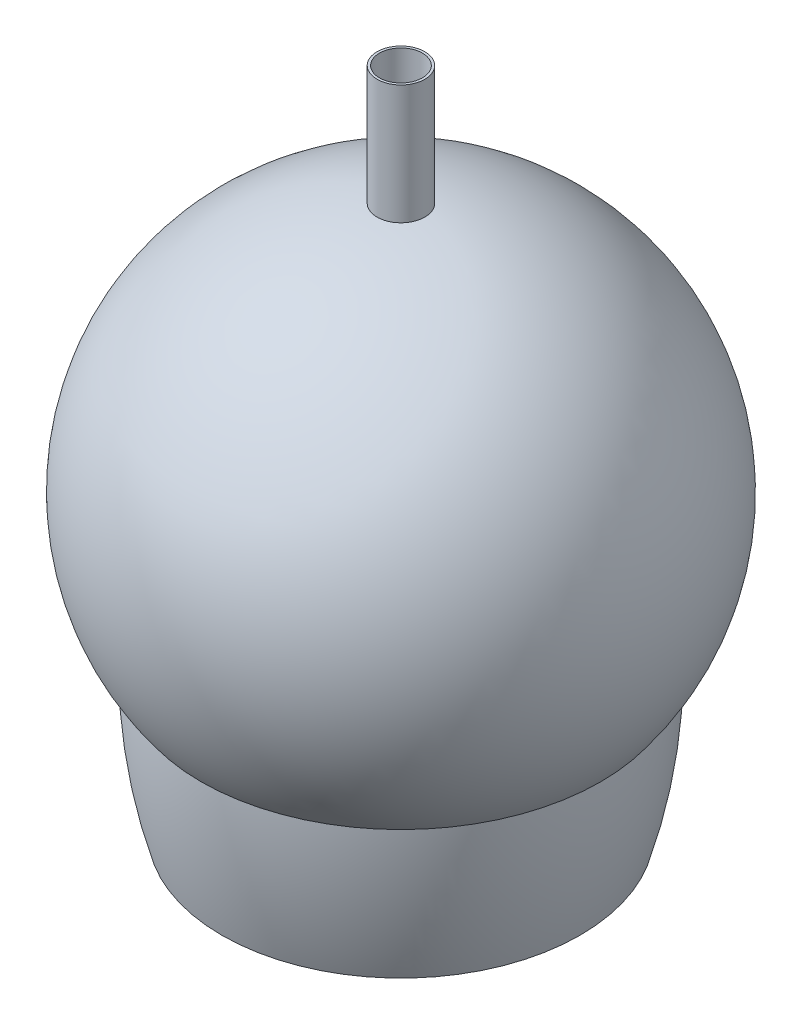
ISO-10303-21;
HEADER;
FILE_DESCRIPTION(('STEP AP214'),'2;1');
FILE_NAME('part.step','',(''),(''),'','','');
FILE_SCHEMA(('AUTOMOTIVE_DESIGN { 1 0 10303 214 1 1 1 1 }'));
ENDSEC;
DATA;
#1=APPLICATION_CONTEXT('core data for automotive mechanical design processes');
#2=APPLICATION_PROTOCOL_DEFINITION('international standard','automotive_design',2000,#1);
#3=PRODUCT_CONTEXT('',#1,'mechanical');
#4=PRODUCT('Part','Part','',(#3));
#5=PRODUCT_RELATED_PRODUCT_CATEGORY('part','',(#4));
#6=PRODUCT_DEFINITION_FORMATION('','',#4);
#7=PRODUCT_DEFINITION_CONTEXT('part definition',#1,'design');
#8=PRODUCT_DEFINITION('design','',#6,#7);
#9=PRODUCT_DEFINITION_SHAPE('','',#8);
#10=(LENGTH_UNIT() NAMED_UNIT(*) SI_UNIT(.MILLI.,.METRE.));
#11=(NAMED_UNIT(*) PLANE_ANGLE_UNIT() SI_UNIT($,.RADIAN.));
#12=(NAMED_UNIT(*) SI_UNIT($,.STERADIAN.) SOLID_ANGLE_UNIT());
#13=UNCERTAINTY_MEASURE_WITH_UNIT(LENGTH_MEASURE(1.E-05),#10,'distance_accuracy_value','');
#14=(GEOMETRIC_REPRESENTATION_CONTEXT(3) GLOBAL_UNCERTAINTY_ASSIGNED_CONTEXT((#13)) GLOBAL_UNIT_ASSIGNED_CONTEXT((#10,
#11,#12)) REPRESENTATION_CONTEXT('',''));
#15=CARTESIAN_POINT('',(0.,0.,0.));
#16=DIRECTION('',(0.,0.,1.));
#17=DIRECTION('',(1.,0.,0.));
#18=AXIS2_PLACEMENT_3D('',#15,#16,#17);
#19=CARTESIAN_POINT('',(0.,0.,0.));
#20=DIRECTION('',(0.,-1.,0.));
#21=DIRECTION('',(0.,0.,-1.));
#22=AXIS2_PLACEMENT_3D('',#19,#20,#21);
#23=CYLINDRICAL_SURFACE('',#22,9.);
#24=CARTESIAN_POINT('',(0.,277.966543330308,0.));
#25=DIRECTION('',(0.,-1.,0.));
#26=DIRECTION('',(0.,0.,-1.));
#27=AXIS2_PLACEMENT_3D('',#24,#25,#26);
#28=CIRCLE('',#27,9.);
#29=CARTESIAN_POINT('',(0.,277.966543330308,-9.));
#30=VERTEX_POINT('',#29);
#31=EDGE_CURVE('E76',#30,#30,#28,.T.);
#32=ORIENTED_EDGE('',*,*,#31,.F.);
#33=EDGE_LOOP('',(#32));
#34=FACE_BOUND('',#33,.T.);
#35=CARTESIAN_POINT('',(0.,227.053663620531,0.));
#36=DIRECTION('',(0.,-1.,0.));
#37=DIRECTION('',(0.,0.,-1.));
#38=AXIS2_PLACEMENT_3D('',#35,#36,#37);
#39=CIRCLE('',#38,9.);
#40=CARTESIAN_POINT('',(-8.99999999999953,227.053663620531,0.));
#41=VERTEX_POINT('',#40);
#42=EDGE_CURVE('E10',#41,#41,#39,.T.);
#43=ORIENTED_EDGE('',*,*,#42,.T.);
#44=EDGE_LOOP('',(#43));
#45=FACE_BOUND('',#44,.T.);
#46=ADVANCED_FACE('F41',(#34,#45),#23,.F.);
#47=CARTESIAN_POINT('',(0.,123.443818528474,0.));
#48=DIRECTION('',(0.,-1.,0.));
#49=DIRECTION('',(-1.,0.,0.));
#50=AXIS2_PLACEMENT_3D('',#47,#48,#49);
#51=SPHERICAL_SURFACE('',#50,104.);
#52=CARTESIAN_POINT('',(0.,60.3383292849695,0.));
#53=DIRECTION('',(0.,-1.,0.));
#54=DIRECTION('',(0.,0.,-1.));
#55=AXIS2_PLACEMENT_3D('',#52,#53,#54);
#56=CIRCLE('',#55,82.6661794649901);
#57=CARTESIAN_POINT('',(-82.6661794649901,60.3383292849695,0.));
#58=VERTEX_POINT('',#57);
#59=EDGE_CURVE('E48',#58,#58,#56,.T.);
#60=CARTESIAN_POINT('',(-8.99999999999953,227.053663620531,0.));
#61=CARTESIAN_POINT('',(-10.1527453132222,226.953538919084,0.));
#62=CARTESIAN_POINT('',(-11.3038177871058,226.834161308276,0.));
#63=CARTESIAN_POINT('',(-13.6013388798546,226.557066931475,0.));
#64=CARTESIAN_POINT('',(-14.7477874987198,226.399350165481,0.));
#65=CARTESIAN_POINT('',(-17.0347827050919,226.045744141842,0.));
#66=CARTESIAN_POINT('',(-18.1753292925988,225.849854884197,0.));
#67=CARTESIAN_POINT('',(-20.4492502146285,225.420124506647,0.));
#68=CARTESIAN_POINT('',(-21.5826245491513,225.186283386741,0.));
#69=CARTESIAN_POINT('',(-23.8409383633198,224.680909124289,0.));
#70=CARTESIAN_POINT('',(-24.9658778429656,224.409375981744,0.));
#71=CARTESIAN_POINT('',(-27.2060688405937,223.828920322319,0.));
#72=CARTESIAN_POINT('',(-28.3213203585762,223.519997805441,0.));
#73=CARTESIAN_POINT('',(-30.5408930914573,222.865107475449,0.));
#74=CARTESIAN_POINT('',(-31.645214306356,222.519139662335,0.));
#75=CARTESIAN_POINT('',(-33.8416962745883,221.790544143611,0.));
#76=CARTESIAN_POINT('',(-34.9338570279219,221.407916438001,0.));
#77=CARTESIAN_POINT('',(-37.1048014587974,220.606427359551,0.));
#78=CARTESIAN_POINT('',(-38.1835851363394,220.187565986712,0.));
#79=CARTESIAN_POINT('',(-40.3265737033262,219.314076165843,0.));
#80=CARTESIAN_POINT('',(-41.3907785927711,218.859447717814,0.));
#81=CARTESIAN_POINT('',(-43.5034241111803,217.914930180248,0.));
#82=CARTESIAN_POINT('',(-44.5518647401446,217.425041090712,0.));
#83=CARTESIAN_POINT('',(-46.6318138258636,216.410547982755,0.));
#84=CARTESIAN_POINT('',(-47.6633222826183,215.885943964335,0.));
#85=CARTESIAN_POINT('',(-49.7082579737931,214.802605381887,0.));
#86=CARTESIAN_POINT('',(-50.7216852082132,214.24387081786,0.));
#87=CARTESIAN_POINT('',(-52.7293295461968,213.092893547265,0.));
#88=CARTESIAN_POINT('',(-53.7235466497603,212.500650840697,0.));
#89=CARTESIAN_POINT('',(-55.6916632166566,211.283317014513,0.));
#90=CARTESIAN_POINT('',(-56.6655626799896,210.658225894898,0.));
#91=CARTESIAN_POINT('',(-58.5919590899117,209.375891563648,0.));
#92=CARTESIAN_POINT('',(-59.544456036501,208.718648352013,0.));
#93=CARTESIAN_POINT('',(-61.4269863777827,207.372741973613,0.));
#94=CARTESIAN_POINT('',(-62.3570197724751,206.684078806848,0.));
#95=CARTESIAN_POINT('',(-64.1935869981114,205.276099655375,0.));
#96=CARTESIAN_POINT('',(-65.1001208290553,204.556783670668,0.));
#97=CARTESIAN_POINT('',(-66.888679092711,203.088300166241,0.));
#98=CARTESIAN_POINT('',(-67.7707035254228,202.339132646523,0.));
#99=CARTESIAN_POINT('',(-69.5092604604052,200.811780608161,0.));
#100=CARTESIAN_POINT('',(-70.3657929626759,200.033596089518,0.));
#101=CARTESIAN_POINT('',(-72.0524119013345,198.449076912915,0.));
#102=CARTESIAN_POINT('',(-72.8824983377224,197.642742254955,0.));
#103=CARTESIAN_POINT('',(-74.5153004688018,196.002821017211,0.));
#104=CARTESIAN_POINT('',(-75.3180161634932,195.169234437426,0.));
#105=CARTESIAN_POINT('',(-76.8951826250375,193.475737930832,0.));
#106=CARTESIAN_POINT('',(-77.6696333918904,192.615828004025,0.));
#107=CARTESIAN_POINT('',(-79.1894072973668,190.870642701114,0.));
#108=CARTESIAN_POINT('',(-79.9347304359904,189.985367325011,0.));
#109=CARTESIAN_POINT('',(-81.3954188313749,188.190437277111,0.));
#110=CARTESIAN_POINT('',(-82.1107840881359,187.280782605315,0.));
#111=CARTESIAN_POINT('',(-83.5107598377816,185.438107276976,0.));
#112=CARTESIAN_POINT('',(-84.1953703306664,184.505086620434,0.));
#113=CARTESIAN_POINT('',(-85.5330739298535,182.616718662121,0.));
#114=CARTESIAN_POINT('',(-86.1861670361558,181.661371360349,0.));
#115=CARTESIAN_POINT('',(-87.4601083483033,179.729414321886,0.));
#116=CARTESIAN_POINT('',(-88.0809565541486,178.752804585194,0.));
#117=CARTESIAN_POINT('',(-89.2897164707544,176.779410572517,0.));
#118=CARTESIAN_POINT('',(-89.8776281815149,175.782626296531,0.));
#119=CARTESIAN_POINT('',(-91.019860202973,173.769993574344,0.));
#120=CARTESIAN_POINT('',(-91.5741805136706,172.754145128143,0.));
#121=CARTESIAN_POINT('',(-92.6486122492063,170.704515671158,0.));
#122=CARTESIAN_POINT('',(-93.1687236740444,169.670734660376,0.));
#123=CARTESIAN_POINT('',(-94.1741582590953,167.586391655866,0.));
#124=CARTESIAN_POINT('',(-94.6594814193081,166.53582966214,0.));
#125=CARTESIAN_POINT('',(-95.5947988487732,164.419094966576,0.));
#126=CARTESIAN_POINT('',(-96.0447931180255,163.352922264739,0.));
#127=CARTESIAN_POINT('',(-96.908951493896,161.206153817357,0.));
#128=CARTESIAN_POINT('',(-97.3231156005142,160.125558071812,0.));
#129=CARTESIAN_POINT('',(-98.1151522924972,157.951147267981,0.));
#130=CARTESIAN_POINT('',(-98.4930248778619,156.857332209696,0.));
#131=CARTESIAN_POINT('',(-99.2120575957036,154.657701237024,0.));
#132=CARTESIAN_POINT('',(-99.5532177281805,153.551885322637,0.));
#133=CARTESIAN_POINT('',(-100.198445504494,151.329484462771,0.));
#134=CARTESIAN_POINT('',(-100.502513148331,150.21289951729,0.));
#135=CARTESIAN_POINT('',(-101.073217230837,147.970204416419,0.));
#136=CARTESIAN_POINT('',(-101.339853669506,146.844094261027,0.));
#137=CARTESIAN_POINT('',(-101.835398321684,144.583603172135,0.));
#138=CARTESIAN_POINT('',(-102.064306535193,143.449222238634,0.));
#139=CARTESIAN_POINT('',(-102.484139744464,141.173453238569,0.));
#140=CARTESIAN_POINT('',(-102.675064740226,140.032065172005,0.));
#141=CARTESIAN_POINT('',(-103.018718832868,137.743553356463,0.));
#142=CARTESIAN_POINT('',(-103.171447929747,136.596429607486,0.));
#143=CARTESIAN_POINT('',(-103.438540091857,134.297724267038,0.));
#144=CARTESIAN_POINT('',(-103.552903157087,133.146142675568,0.));
#145=CARTESIAN_POINT('',(-103.74313586102,130.839804455874,0.));
#146=CARTESIAN_POINT('',(-103.819005499722,129.685047827651,0.));
#147=CARTESIAN_POINT('',(-103.932166835522,127.373645877029,0.));
#148=CARTESIAN_POINT('',(-103.96945853262,126.217000554629,0.));
#149=CARTESIAN_POINT('',(-104.005422444077,123.903109662141,0.));
#150=CARTESIAN_POINT('',(-104.004094658436,122.745864092054,0.));
#151=CARTESIAN_POINT('',(-103.962821083507,120.432061819327,0.));
#152=CARTESIAN_POINT('',(-103.922875294217,119.275505116688,0.));
#153=CARTESIAN_POINT('',(-103.804410209651,116.964368926628,0.));
#154=CARTESIAN_POINT('',(-103.725890914374,115.809789439208,0.));
#155=CARTESIAN_POINT('',(-103.530366284498,113.503893824837,0.));
#156=CARTESIAN_POINT('',(-103.4133609499,112.352577697886,0.));
#157=CARTESIAN_POINT('',(-103.140994579618,110.054491314479,0.));
#158=CARTESIAN_POINT('',(-102.985633543936,108.907721058022,0.));
#159=CARTESIAN_POINT('',(-102.636728836105,106.62000386175,0.));
#160=CARTESIAN_POINT('',(-102.443185163956,105.479056921935,0.));
#161=CARTESIAN_POINT('',(-102.018130781406,103.204257318204,0.));
#162=CARTESIAN_POINT('',(-101.786620071004,102.070404654287,0.));
#163=CARTESIAN_POINT('',(-101.285889503592,99.8110566589302,0.));
#164=CARTESIAN_POINT('',(-101.016669646581,98.68556132749,0.));
#165=CARTESIAN_POINT('',(-100.440820683739,96.4441817440072,0.));
#166=CARTESIAN_POINT('',(-100.134191577908,95.3282974919645,0.));
#167=CARTESIAN_POINT('',(-99.4838656873118,93.107383107911,0.));
#168=CARTESIAN_POINT('',(-99.140168902547,92.0023529759001,0.));
#169=CARTESIAN_POINT('',(-98.4160905154897,89.8043777816316,0.));
#170=CARTESIAN_POINT('',(-98.0357089131973,88.711432719374,0.));
#171=CARTESIAN_POINT('',(-97.2386846178386,86.5388451519775,0.));
#172=CARTESIAN_POINT('',(-96.8220419247723,85.4592026468386,0.));
#173=CARTESIAN_POINT('',(-95.9529595667753,83.314422863308,0.));
#174=CARTESIAN_POINT('',(-95.5005199018447,82.2492855849162,0.));
#175=CARTESIAN_POINT('',(-94.5603475985849,80.1347027639188,0.));
#176=CARTESIAN_POINT('',(-94.0726149602557,79.0852572213132,0.));
#177=CARTESIAN_POINT('',(-93.0624000103462,77.0032269103316,0.));
#178=CARTESIAN_POINT('',(-92.5399176987658,75.9706421419555,0.));
#179=CARTESIAN_POINT('',(-91.4607854603477,73.9234836013392,0.));
#180=CARTESIAN_POINT('',(-90.90413553351,72.9089098290989,0.));
#181=CARTESIAN_POINT('',(-89.7572880029782,70.8989035678833,0.));
#182=CARTESIAN_POINT('',(-89.1670903992842,69.9034710789079,0.));
#183=CARTESIAN_POINT('',(-87.9538054981122,67.9328558689742,0.));
#184=CARTESIAN_POINT('',(-87.3307182006342,66.9576731480158,0.));
#185=CARTESIAN_POINT('',(-86.0523460163521,65.0286451927034,0.));
#186=CARTESIAN_POINT('',(-85.3970611295481,64.0747999583495,0.));
#187=CARTESIAN_POINT('',(-84.0550311279388,62.1895042414761,0.));
#188=CARTESIAN_POINT('',(-83.3682860131335,61.2580537589567,0.));
#189=CARTESIAN_POINT('',(-82.6661794649901,60.3383292849696,0.));
#190=B_SPLINE_CURVE_WITH_KNOTS('',3,(#60,#61,#62,#63,#64,#65,#66,#67,#68,#69,#70,#71,#72,#73,
#74,#75,#76,#77,#78,#79,#80,#81,#82,#83,#84,#85,#86,#87,#88,#89,#90,#91,#92,#93,#94,#95,#96,#97,
#98,#99,#100,#101,#102,#103,#104,#105,#106,#107,#108,#109,#110,#111,#112,#113,#114,#115,#116,
#117,#118,#119,#120,#121,#122,#123,#124,#125,#126,#127,#128,#129,#130,#131,#132,#133,#134,#135,
#136,#137,#138,#139,#140,#141,#142,#143,#144,#145,#146,#147,#148,#149,#150,#151,#152,#153,#154,
#155,#156,#157,#158,#159,#160,#161,#162,#163,#164,#165,#166,#167,#168,#169,#170,#171,#172,#173,
#174,#175,#176,#177,#178,#179,#180,#181,#182,#183,#184,#185,#186,#187,#188,#189),.UNSPECIFIED.,
.F.,.F.,(4,2,2,2,2,2,2,2,2,2,2,2,2,2,2,2,2,2,2,2,2,2,2,2,2,2,2,2,2,2,2,2,2,2,2,2,2,2,2,2,2,2,2,
2,2,2,2,2,2,2,2,2,2,2,2,2,2,2,2,2,2,2,2,2,4),(0.,3.47109443745622,6.94218887491244,
10.4132833123686,13.8843777498249,17.3554721872811,20.8265666247373,24.2976610621935,
27.7687554996497,31.2398499371059,34.7109443745622,38.1820388120184,41.6531332494746,
45.1242276869308,48.595322124387,52.0664165618432,55.5375109992995,59.0086054367557,
62.4796998742119,65.9507943116681,69.4218887491243,72.8929831865805,76.3640776240368,
79.835172061493,83.3062664989492,86.7773609364054,90.2484553738616,93.7195498113178,
97.1906442487741,100.66173868623,104.132833123686,107.603927561143,111.075021998599,
114.546116436055,118.017210873511,121.488305310968,124.959399748424,128.43049418588,
131.901588623336,135.372683060792,138.843777498249,142.314871935705,145.785966373161,
149.257060810617,152.728155248074,156.19924968553,159.670344122986,163.141438560442,
166.612532997898,170.083627435355,173.554721872811,177.025816310267,180.496910747723,
183.968005185179,187.439099622636,190.910194060092,194.381288497548,197.852382935004,
201.323477372461,204.794571809917,208.265666247373,211.736760684829,215.207855122285,
218.678949559742,222.150043997198),.UNSPECIFIED.);
#191=EDGE_CURVE('BSEAM85',#41,#58,#190,.T.);
#192=ORIENTED_EDGE('',*,*,#42,.F.);
#193=ORIENTED_EDGE('',*,*,#59,.T.);
#194=ORIENTED_EDGE('',*,*,#191,.T.);
#195=ORIENTED_EDGE('',*,*,#191,.F.);
#196=EDGE_LOOP('',(#192,#194,#193,#195));
#197=FACE_BOUND('',#196,.T.);
#198=ADVANCED_FACE('F85',(#197),#51,.F.);
#199=CARTESIAN_POINT('',(0.,60.736789836198,0.));
#200=DIRECTION('',(0.,-1.,0.));
#201=DIRECTION('',(0.,0.,-1.));
#202=AXIS2_PLACEMENT_3D('',#199,#200,#201);
#203=DEGENERATE_TOROIDAL_SURFACE('',#202,133.494151452246,216.160698169348,.F.);
#204=ORIENTED_EDGE('',*,*,#59,.F.);
#205=EDGE_LOOP('',(#204));
#206=FACE_BOUND('',#205,.T.);
#207=CARTESIAN_POINT('',(0.,1.,0.));
#208=DIRECTION('',(0.,-1.,0.));
#209=DIRECTION('',(0.,0.,-1.));
#210=AXIS2_PLACEMENT_3D('',#207,#208,#209);
#211=CIRCLE('',#210,74.2483896247462);
#212=CARTESIAN_POINT('',(0.,1.,-74.2483896247462));
#213=VERTEX_POINT('',#212);
#214=EDGE_CURVE('E53',#213,#213,#211,.T.);
#215=ORIENTED_EDGE('',*,*,#214,.T.);
#216=EDGE_LOOP('',(#215));
#217=FACE_BOUND('',#216,.T.);
#218=ADVANCED_FACE('F89',(#206,#217),#203,.T.);
#219=CARTESIAN_POINT('',(0.,1.,0.));
#220=DIRECTION('',(0.,-1.,0.));
#221=DIRECTION('',(0.,0.,-1.));
#222=AXIS2_PLACEMENT_3D('',#219,#220,#221);
#223=PLANE('',#222);
#224=ORIENTED_EDGE('',*,*,#214,.F.);
#225=EDGE_LOOP('',(#224));
#226=FACE_BOUND('',#225,.T.);
#227=ADVANCED_FACE('F94',(#226),#223,.F.);
#228=CARTESIAN_POINT('',(0.,0.,0.));
#229=DIRECTION('',(0.,-1.,0.));
#230=DIRECTION('',(0.,0.,-1.));
#231=AXIS2_PLACEMENT_3D('',#228,#229,#230);
#232=PLANE('',#231);
#233=CARTESIAN_POINT('',(0.,0.,0.));
#234=DIRECTION('',(0.,-1.,0.));
#235=DIRECTION('',(0.,0.,-1.));
#236=AXIS2_PLACEMENT_3D('',#233,#234,#235);
#237=CIRCLE('',#236,75.);
#238=CARTESIAN_POINT('',(0.,0.,-75.));
#239=VERTEX_POINT('',#238);
#240=EDGE_CURVE('E58',#239,#239,#237,.T.);
#241=ORIENTED_EDGE('',*,*,#240,.T.);
#242=EDGE_LOOP('',(#241));
#243=FACE_BOUND('',#242,.T.);
#244=ADVANCED_FACE('F100',(#243),#232,.T.);
#245=CARTESIAN_POINT('',(0.,60.736789836198,0.));
#246=DIRECTION('',(0.,-1.,0.));
#247=DIRECTION('',(0.,0.,-1.));
#248=AXIS2_PLACEMENT_3D('',#245,#246,#247);
#249=DEGENERATE_TOROIDAL_SURFACE('',#248,133.494151452246,217.160698169348,.F.);
#250=CARTESIAN_POINT('',(0.,59.9999999999999,0.));
#251=DIRECTION('',(0.,-1.,0.));
#252=DIRECTION('',(0.,0.,-1.));
#253=AXIS2_PLACEMENT_3D('',#250,#251,#252);
#254=CIRCLE('',#253,83.6652968113187);
#255=CARTESIAN_POINT('',(-83.6652968113187,59.9999999999999,0.));
#256=VERTEX_POINT('',#255);
#257=EDGE_CURVE('E64',#256,#256,#254,.T.);
#258=ORIENTED_EDGE('',*,*,#257,.T.);
#259=EDGE_LOOP('',(#258));
#260=FACE_BOUND('',#259,.T.);
#261=ORIENTED_EDGE('',*,*,#240,.F.);
#262=EDGE_LOOP('',(#261));
#263=FACE_BOUND('',#262,.T.);
#264=ADVANCED_FACE('F104',(#260,#263),#249,.F.);
#265=CARTESIAN_POINT('',(0.,123.443818528474,0.));
#266=DIRECTION('',(0.,-1.,0.));
#267=DIRECTION('',(-1.,0.,0.));
#268=AXIS2_PLACEMENT_3D('',#265,#266,#267);
#269=SPHERICAL_SURFACE('',#268,105.);
#270=CARTESIAN_POINT('',(0.,227.966543330308,0.));
#271=DIRECTION('',(0.,-1.,0.));
#272=DIRECTION('',(0.,0.,-1.));
#273=AXIS2_PLACEMENT_3D('',#270,#271,#272);
#274=CIRCLE('',#273,10.);
#275=CARTESIAN_POINT('',(-10.,227.966543330308,0.));
#276=VERTEX_POINT('',#275);
#277=EDGE_CURVE('E68',#276,#276,#274,.T.);
#278=CARTESIAN_POINT('',(-10.,227.966543330308,0.));
#279=CARTESIAN_POINT('',(-11.1563973173278,227.855915016498,0.));
#280=CARTESIAN_POINT('',(-12.3109567276766,227.726081001033,0.));
#281=CARTESIAN_POINT('',(-14.6151322520734,227.428177798945,0.));
#282=CARTESIAN_POINT('',(-15.7647483661215,227.260108612321,0.));
#283=CARTESIAN_POINT('',(-18.0577698155745,226.885911300059,0.));
#284=CARTESIAN_POINT('',(-19.2011751509794,226.679783174422,0.));
#285=CARTESIAN_POINT('',(-21.4805158611638,226.2296974244,0.));
#286=CARTESIAN_POINT('',(-22.6164512359433,225.985739800017,0.));
#287=CARTESIAN_POINT('',(-24.8796006803025,225.460263139066,0.));
#288=CARTESIAN_POINT('',(-26.0068147498822,225.1787441025,0.));
#289=CARTESIAN_POINT('',(-28.2512799507624,224.57845488885,0.));
#290=CARTESIAN_POINT('',(-29.3685310820628,224.259684711766,0.));
#291=CARTESIAN_POINT('',(-31.5918397196685,223.585244304731,0.));
#292=CARTESIAN_POINT('',(-32.6978972259737,223.229574074779,0.));
#293=CARTESIAN_POINT('',(-34.897600264459,222.481725354184,0.));
#294=CARTESIAN_POINT('',(-35.9912457966391,222.08954686354,0.));
#295=CARTESIAN_POINT('',(-38.164920207837,221.269113612936,0.));
#296=CARTESIAN_POINT('',(-39.2449490868547,220.840858852975,0.));
#297=CARTESIAN_POINT('',(-41.3902005123235,219.948744798224,0.));
#298=CARTESIAN_POINT('',(-42.4554230587745,219.484885503434,0.));
#299=CARTESIAN_POINT('',(-44.5698884491159,218.522073331702,0.));
#300=CARTESIAN_POINT('',(-45.6191312930063,218.02312045476,0.));
#301=CARTESIAN_POINT('',(-47.7004815103234,216.990670728181,0.));
#302=CARTESIAN_POINT('',(-48.7325888837503,216.457173878544,0.));
#303=CARTESIAN_POINT('',(-50.7785312673875,215.356223867027,0.));
#304=CARTESIAN_POINT('',(-51.792366277598,214.788770705146,0.));
#305=CARTESIAN_POINT('',(-53.8006471695292,213.62053313336,0.));
#306=CARTESIAN_POINT('',(-54.79509305125,213.019748723455,0.));
#307=CARTESIAN_POINT('',(-56.7635002785504,211.785510435061,0.));
#308=CARTESIAN_POINT('',(-57.73746162413,211.152056556571,0.));
#309=CARTESIAN_POINT('',(-59.6638269357389,209.853177096707,0.));
#310=CARTESIAN_POINT('',(-60.6162309017681,209.187751515332,0.));
#311=CARTESIAN_POINT('',(-62.4984323568734,207.825661633046,0.));
#312=CARTESIAN_POINT('',(-63.4282298459496,207.128997332135,0.));
#313=CARTESIAN_POINT('',(-65.2641941513605,205.705197404376,0.));
#314=CARTESIAN_POINT('',(-66.1703609676954,204.978061777529,0.));
#315=CARTESIAN_POINT('',(-67.9580657616276,203.494120156448,0.));
#316=CARTESIAN_POINT('',(-68.8396037392249,202.737314162213,0.));
#317=CARTESIAN_POINT('',(-70.577079818984,201.194865447573,0.));
#318=CARTESIAN_POINT('',(-71.4330179211457,200.409222727169,0.));
#319=CARTESIAN_POINT('',(-73.1183514122547,198.809965965804,0.));
#320=CARTESIAN_POINT('',(-73.9477468012019,197.996351924842,0.));
#321=CARTESIAN_POINT('',(-75.5790812655827,196.342048739102,0.));
#322=CARTESIAN_POINT('',(-76.3810203410163,195.501359594323,0.));
#323=CARTESIAN_POINT('',(-77.9565588219044,193.793832241608,0.));
#324=CARTESIAN_POINT('',(-78.7301582273589,192.926994033673,0.));
#325=CARTESIAN_POINT('',(-80.2481652286969,191.16812339917,0.));
#326=CARTESIAN_POINT('',(-80.9925728245804,190.276090972603,0.));
#327=CARTESIAN_POINT('',(-82.4513762227117,188.46781449744,0.));
#328=CARTESIAN_POINT('',(-83.1657720249594,187.551570448844,0.));
#329=CARTESIAN_POINT('',(-84.563764910515,185.69587999595,0.));
#330=CARTESIAN_POINT('',(-85.2473619938229,184.756433591651,0.));
#331=CARTESIAN_POINT('',(-86.5830044417738,182.855373251668,0.));
#332=CARTESIAN_POINT('',(-87.2350498064168,181.893759315982,0.));
#333=CARTESIAN_POINT('',(-88.5068705723403,179.949423155646,0.));
#334=CARTESIAN_POINT('',(-89.1266459736209,178.966700930994,0.));
#335=CARTESIAN_POINT('',(-90.3332441143148,176.981230686467,0.));
#336=CARTESIAN_POINT('',(-90.920066853728,175.978482666592,0.));
#337=CARTESIAN_POINT('',(-92.0601132703848,173.954065384287,0.));
#338=CARTESIAN_POINT('',(-92.6133369476282,172.932396121857,0.));
#339=CARTESIAN_POINT('',(-93.6855758498719,170.871261749347,0.));
#340=CARTESIAN_POINT('',(-94.204591074872,169.831796639267,0.));
#341=CARTESIAN_POINT('',(-95.2078413640432,167.736215568942,0.));
#342=CARTESIAN_POINT('',(-95.6920764282143,166.680099608697,0.));
#343=CARTESIAN_POINT('',(-96.6252329983811,164.552380176868,0.));
#344=CARTESIAN_POINT('',(-97.0741545043768,163.480776705284,0.));
#345=CARTESIAN_POINT('',(-97.9361894596367,161.323262649493,0.));
#346=CARTESIAN_POINT('',(-98.3493029089011,160.237352065286,0.));
#347=CARTESIAN_POINT('',(-99.1392666956355,158.052419942616,0.));
#348=CARTESIAN_POINT('',(-99.5161170331055,156.953398404153,0.));
#349=CARTESIAN_POINT('',(-100.233139485937,154.743454973392,0.));
#350=CARTESIAN_POINT('',(-100.573311601298,153.632533081094,0.));
#351=CARTESIAN_POINT('',(-101.216602901598,151.400012651627,0.));
#352=CARTESIAN_POINT('',(-101.519722086538,150.278414114459,0.));
#353=CARTESIAN_POINT('',(-102.088573632437,148.025775864816,0.));
#354=CARTESIAN_POINT('',(-102.354305993397,146.894736152341,0.));
#355=CARTESIAN_POINT('',(-102.848091180323,144.624461421345,0.));
#356=CARTESIAN_POINT('',(-103.076144006289,143.485226402824,0.));
#357=CARTESIAN_POINT('',(-103.49431891719,141.199815956335,0.));
#358=CARTESIAN_POINT('',(-103.684441002125,140.053640528367,0.));
#359=CARTESIAN_POINT('',(-104.026545006609,137.755611804625,0.));
#360=CARTESIAN_POINT('',(-104.178526926158,136.603758508851,0.));
#361=CARTESIAN_POINT('',(-104.444183187886,134.295642845451,0.));
#362=CARTESIAN_POINT('',(-104.557857530066,133.139380477826,0.));
#363=CARTESIAN_POINT('',(-104.746773421852,130.823720323386,0.));
#364=CARTESIAN_POINT('',(-104.822014971458,129.664322536572,0.));
#365=CARTESIAN_POINT('',(-104.933982397599,127.343668650162,0.));
#366=CARTESIAN_POINT('',(-104.970708274134,126.182412550566,0.));
#367=CARTESIAN_POINT('',(-105.005603899639,123.859321191978,0.));
#368=CARTESIAN_POINT('',(-105.003773648608,122.697485932985,0.));
#369=CARTESIAN_POINT('',(-104.961559035049,120.37451604695,0.));
#370=CARTESIAN_POINT('',(-104.921174672521,119.213381419906,0.));
#371=CARTESIAN_POINT('',(-104.801896320379,116.893091817348,0.));
#372=CARTESIAN_POINT('',(-104.723002330764,115.733936841834,0.));
#373=CARTESIAN_POINT('',(-104.526791628203,113.418883381279,0.));
#374=CARTESIAN_POINT('',(-104.409474915256,112.262984896238,0.));
#375=CARTESIAN_POINT('',(-104.136547993399,109.955717668466,0.));
#376=CARTESIAN_POINT('',(-103.980937784489,108.804348925734,0.));
#377=CARTESIAN_POINT('',(-103.631595279342,106.507409444789,0.));
#378=CARTESIAN_POINT('',(-103.437862983106,105.361838706575,0.));
#379=CARTESIAN_POINT('',(-103.012489704401,103.077757110224,0.));
#380=CARTESIAN_POINT('',(-102.780848721933,101.939246252086,0.));
#381=CARTESIAN_POINT('',(-102.27991322925,99.6705385148052,0.));
#382=CARTESIAN_POINT('',(-102.010618719036,98.5403416356617,0.));
#383=CARTESIAN_POINT('',(-101.434672805671,96.2895067972293,0.));
#384=CARTESIAN_POINT('',(-101.128021402519,95.1688688379404,0.));
#385=CARTESIAN_POINT('',(-100.477699487679,92.9383862506697,0.));
#386=CARTESIAN_POINT('',(-100.134028975991,91.8285416226878,0.));
#387=CARTESIAN_POINT('',(-99.4100474059126,89.6208682203988,0.));
#388=CARTESIAN_POINT('',(-99.0297363475221,88.5230394460917,0.));
#389=CARTESIAN_POINT('',(-98.2328926066207,86.3406070375746,0.));
#390=CARTESIAN_POINT('',(-97.8163599241099,85.2560034033645,0.));
#391=CARTESIAN_POINT('',(-96.9475317556775,83.101215994284,0.));
#392=CARTESIAN_POINT('',(-96.4952362697559,82.0310322194135,0.));
#393=CARTESIAN_POINT('',(-95.5553807122949,79.9062633619781,0.));
#394=CARTESIAN_POINT('',(-95.0678206407556,78.8516782794131,0.));
#395=CARTESIAN_POINT('',(-94.0579729618663,76.7592684662704,0.));
#396=CARTESIAN_POINT('',(-93.5356853545163,75.7214437356928,0.));
#397=CARTESIAN_POINT('',(-92.4569579549735,73.6636977903773,0.));
#398=CARTESIAN_POINT('',(-91.9005181627807,72.6437765756396,0.));
#399=CARTESIAN_POINT('',(-90.7540991853035,70.622961231085,0.));
#400=CARTESIAN_POINT('',(-90.1641200000191,69.6220671012682,0.));
#401=CARTESIAN_POINT('',(-88.9512726396196,67.6404080650442,0.));
#402=CARTESIAN_POINT('',(-88.3284044645046,66.659643158637,0.));
#403=CARTESIAN_POINT('',(-87.0504632664647,64.7193242955354,0.));
#404=CARTESIAN_POINT('',(-86.39539024354,63.759770338841,0.));
#405=CARTESIAN_POINT('',(-85.0537682565837,61.8629251661504,0.));
#406=CARTESIAN_POINT('',(-84.3672192925522,60.9256339501543,0.));
#407=CARTESIAN_POINT('',(-83.6652968113186,59.9999999999999,0.));
#408=B_SPLINE_CURVE_WITH_KNOTS('',3,(#278,#279,#280,#281,#282,#283,#284,#285,#286,#287,#288,
#289,#290,#291,#292,#293,#294,#295,#296,#297,#298,#299,#300,#301,#302,#303,#304,#305,#306,#307,
#308,#309,#310,#311,#312,#313,#314,#315,#316,#317,#318,#319,#320,#321,#322,#323,#324,#325,#326,
#327,#328,#329,#330,#331,#332,#333,#334,#335,#336,#337,#338,#339,#340,#341,#342,#343,#344,#345,
#346,#347,#348,#349,#350,#351,#352,#353,#354,#355,#356,#357,#358,#359,#360,#361,#362,#363,#364,
#365,#366,#367,#368,#369,#370,#371,#372,#373,#374,#375,#376,#377,#378,#379,#380,#381,#382,#383,
#384,#385,#386,#387,#388,#389,#390,#391,#392,#393,#394,#395,#396,#397,#398,#399,#400,#401,#402,
#403,#404,#405,#406,#407),.UNSPECIFIED.,.F.,.F.,(4,2,2,2,2,2,2,2,2,2,2,2,2,2,2,2,2,2,2,2,2,2,2,
2,2,2,2,2,2,2,2,2,2,2,2,2,2,2,2,2,2,2,2,2,2,2,2,2,2,2,2,2,2,2,2,2,2,2,2,2,2,2,2,2,4),(0.,
3.48487020532757,6.96974041065515,10.4546106159827,13.9394808213103,17.4243510266379,
20.9092212319654,24.394091437293,27.8789616426206,31.3638318479482,34.8487020532757,
38.3335722586033,41.8184424639309,45.3033126692584,48.788182874586,52.2730530799136,
55.7579232852412,59.2427934905688,62.7276636958963,66.2125339012239,69.6974041065515,
73.182274311879,76.6671445172066,80.1520147225342,83.6368849278618,87.1217551331893,
90.6066253385169,94.0914955438445,97.5763657491721,101.0612359545,104.546106159827,
108.030976365155,111.515846570482,115.00071677581,118.485586981138,121.970457186465,
125.455327391793,128.94019759712,132.425067802448,135.909938007775,139.394808213103,
142.87967841843,146.364548623758,149.849418829086,153.334289034413,156.819159239741,
160.304029445068,163.788899650396,167.273769855723,170.758640061051,174.243510266379,
177.728380471706,181.213250677034,184.698120882361,188.182991087689,191.667861293016,
195.152731498344,198.637601703672,202.122471908999,205.607342114327,209.092212319654,
212.577082524982,216.061952730309,219.546822935637,223.031693140965),.UNSPECIFIED.);
#409=EDGE_CURVE('BSEAM108',#276,#256,#408,.T.);
#410=ORIENTED_EDGE('',*,*,#277,.T.);
#411=ORIENTED_EDGE('',*,*,#257,.F.);
#412=ORIENTED_EDGE('',*,*,#409,.T.);
#413=ORIENTED_EDGE('',*,*,#409,.F.);
#414=EDGE_LOOP('',(#410,#412,#411,#413));
#415=FACE_BOUND('',#414,.T.);
#416=ADVANCED_FACE('F108',(#415),#269,.T.);
#417=CARTESIAN_POINT('',(0.,0.,0.));
#418=DIRECTION('',(0.,-1.,0.));
#419=DIRECTION('',(0.,0.,-1.));
#420=AXIS2_PLACEMENT_3D('',#417,#418,#419);
#421=CYLINDRICAL_SURFACE('',#420,10.);
#422=CARTESIAN_POINT('',(0.,277.966543330308,0.));
#423=DIRECTION('',(0.,-1.,0.));
#424=DIRECTION('',(0.,0.,-1.));
#425=AXIS2_PLACEMENT_3D('',#422,#423,#424);
#426=CIRCLE('',#425,10.);
#427=CARTESIAN_POINT('',(0.,277.966543330308,-10.));
#428=VERTEX_POINT('',#427);
#429=EDGE_CURVE('E72',#428,#428,#426,.T.);
#430=ORIENTED_EDGE('',*,*,#429,.T.);
#431=EDGE_LOOP('',(#430));
#432=FACE_BOUND('',#431,.T.);
#433=ORIENTED_EDGE('',*,*,#277,.F.);
#434=EDGE_LOOP('',(#433));
#435=FACE_BOUND('',#434,.T.);
#436=ADVANCED_FACE('F112',(#432,#435),#421,.T.);
#437=CARTESIAN_POINT('',(-10.,277.966543330308,0.));
#438=DIRECTION('',(0.,1.,0.));
#439=DIRECTION('',(0.,0.,1.));
#440=AXIS2_PLACEMENT_3D('',#437,#438,#439);
#441=PLANE('',#440);
#442=ORIENTED_EDGE('',*,*,#31,.T.);
#443=EDGE_LOOP('',(#442));
#444=FACE_BOUND('',#443,.T.);
#445=ORIENTED_EDGE('',*,*,#429,.F.);
#446=EDGE_LOOP('',(#445));
#447=FACE_BOUND('',#446,.T.);
#448=ADVANCED_FACE('F81',(#444,#447),#441,.T.);
#449=CLOSED_SHELL('',(#46,#198,#218,#227,#244,#264,#416,#436,#448));
#450=MANIFOLD_SOLID_BREP('B2',#449);
#451=ADVANCED_BREP_SHAPE_REPRESENTATION('',(#18,#450),#14);
#452=SHAPE_DEFINITION_REPRESENTATION(#9,#451);
ENDSEC;
END-ISO-10303-21;
